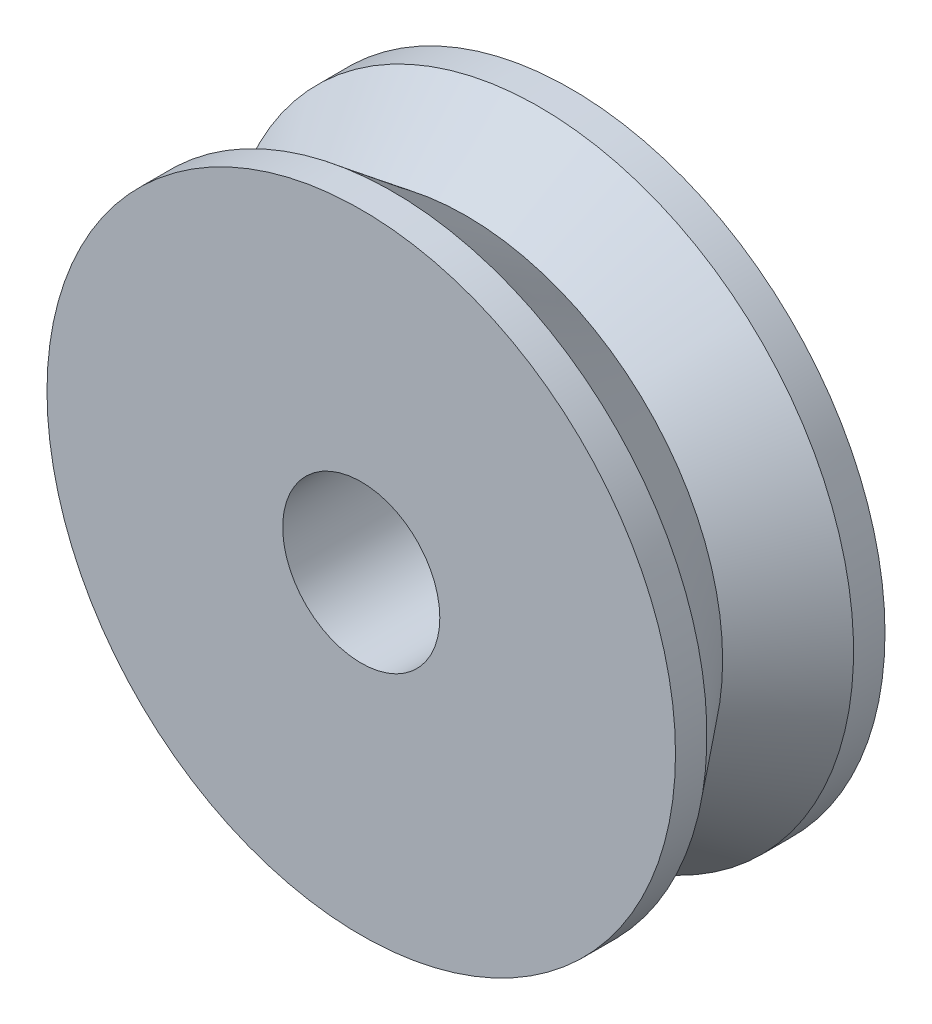
ISO-10303-21;
HEADER;
FILE_DESCRIPTION(('STEP AP214'),'2;1');
FILE_NAME('part.step','',(''),(''),'','','');
FILE_SCHEMA(('AUTOMOTIVE_DESIGN { 1 0 10303 214 1 1 1 1 }'));
ENDSEC;
DATA;
#1=APPLICATION_CONTEXT('core data for automotive mechanical design processes');
#2=APPLICATION_PROTOCOL_DEFINITION('international standard','automotive_design',2000,#1);
#3=PRODUCT_CONTEXT('',#1,'mechanical');
#4=PRODUCT('Part','Part','',(#3));
#5=PRODUCT_RELATED_PRODUCT_CATEGORY('part','',(#4));
#6=PRODUCT_DEFINITION_FORMATION('','',#4);
#7=PRODUCT_DEFINITION_CONTEXT('part definition',#1,'design');
#8=PRODUCT_DEFINITION('design','',#6,#7);
#9=PRODUCT_DEFINITION_SHAPE('','',#8);
#10=(LENGTH_UNIT() NAMED_UNIT(*) SI_UNIT(.MILLI.,.METRE.));
#11=(NAMED_UNIT(*) PLANE_ANGLE_UNIT() SI_UNIT($,.RADIAN.));
#12=(NAMED_UNIT(*) SI_UNIT($,.STERADIAN.) SOLID_ANGLE_UNIT());
#13=UNCERTAINTY_MEASURE_WITH_UNIT(LENGTH_MEASURE(1.E-05),#10,'distance_accuracy_value','');
#14=(GEOMETRIC_REPRESENTATION_CONTEXT(3) GLOBAL_UNCERTAINTY_ASSIGNED_CONTEXT((#13)) GLOBAL_UNIT_ASSIGNED_CONTEXT((#10,
#11,#12)) REPRESENTATION_CONTEXT('',''));
#15=CARTESIAN_POINT('',(0.,0.,0.));
#16=DIRECTION('',(0.,0.,1.));
#17=DIRECTION('',(1.,0.,0.));
#18=AXIS2_PLACEMENT_3D('',#15,#16,#17);
#19=CARTESIAN_POINT('',(0.,0.,4.));
#20=DIRECTION('',(0.,0.,-1.));
#21=DIRECTION('',(-1.,0.,0.));
#22=AXIS2_PLACEMENT_3D('',#19,#20,#21);
#23=CYLINDRICAL_SURFACE('',#22,6.);
#24=CARTESIAN_POINT('',(0.,0.,0.6));
#25=DIRECTION('',(0.,0.,-1.));
#26=DIRECTION('',(-1.,0.,0.));
#27=AXIS2_PLACEMENT_3D('',#24,#25,#26);
#28=CIRCLE('',#27,6.);
#29=CARTESIAN_POINT('',(-6.,0.,0.6));
#30=VERTEX_POINT('',#29);
#31=EDGE_CURVE('E49',#30,#30,#28,.T.);
#32=ORIENTED_EDGE('',*,*,#31,.T.);
#33=EDGE_LOOP('',(#32));
#34=FACE_BOUND('',#33,.T.);
#35=CARTESIAN_POINT('',(0.,0.,0.));
#36=DIRECTION('',(0.,0.,1.));
#37=DIRECTION('',(1.,0.,0.));
#38=AXIS2_PLACEMENT_3D('',#35,#36,#37);
#39=CIRCLE('',#38,6.);
#40=CARTESIAN_POINT('',(6.,0.,0.));
#41=VERTEX_POINT('',#40);
#42=EDGE_CURVE('E37',#41,#41,#39,.T.);
#43=ORIENTED_EDGE('',*,*,#42,.T.);
#44=EDGE_LOOP('',(#43));
#45=FACE_BOUND('',#44,.T.);
#46=ADVANCED_FACE('F33',(#34,#45),#23,.T.);
#47=CARTESIAN_POINT('',(0.,0.,4.));
#48=DIRECTION('',(0.,0.,1.));
#49=DIRECTION('',(1.,0.,0.));
#50=AXIS2_PLACEMENT_3D('',#47,#48,#49);
#51=PLANE('',#50);
#52=CARTESIAN_POINT('',(0.,0.,4.));
#53=DIRECTION('',(0.,0.,1.));
#54=DIRECTION('',(1.,0.,0.));
#55=AXIS2_PLACEMENT_3D('',#52,#53,#54);
#56=CIRCLE('',#55,6.);
#57=CARTESIAN_POINT('',(6.,0.,4.));
#58=VERTEX_POINT('',#57);
#59=EDGE_CURVE('E10',#58,#58,#56,.T.);
#60=ORIENTED_EDGE('',*,*,#59,.T.);
#61=EDGE_LOOP('',(#60));
#62=FACE_BOUND('',#61,.T.);
#63=CARTESIAN_POINT('',(0.,0.,4.));
#64=DIRECTION('',(0.,0.,1.));
#65=DIRECTION('',(1.,0.,0.));
#66=AXIS2_PLACEMENT_3D('',#63,#64,#65);
#67=CIRCLE('',#66,1.5);
#68=CARTESIAN_POINT('',(1.5,0.,4.));
#69=VERTEX_POINT('',#68);
#70=EDGE_CURVE('E44',#69,#69,#67,.T.);
#71=ORIENTED_EDGE('',*,*,#70,.F.);
#72=EDGE_LOOP('',(#71));
#73=FACE_BOUND('',#72,.T.);
#74=ADVANCED_FACE('F74',(#62,#73),#51,.T.);
#75=CARTESIAN_POINT('',(0.,0.,0.));
#76=DIRECTION('',(0.,0.,1.));
#77=DIRECTION('',(1.,0.,0.));
#78=AXIS2_PLACEMENT_3D('',#75,#76,#77);
#79=PLANE('',#78);
#80=ORIENTED_EDGE('',*,*,#42,.F.);
#81=EDGE_LOOP('',(#80));
#82=FACE_BOUND('',#81,.T.);
#83=CARTESIAN_POINT('',(0.,0.,0.));
#84=DIRECTION('',(0.,0.,1.));
#85=DIRECTION('',(1.,0.,0.));
#86=AXIS2_PLACEMENT_3D('',#83,#84,#85);
#87=CIRCLE('',#86,1.5);
#88=CARTESIAN_POINT('',(1.5,0.,0.));
#89=VERTEX_POINT('',#88);
#90=EDGE_CURVE('E46',#89,#89,#87,.T.);
#91=ORIENTED_EDGE('',*,*,#90,.T.);
#92=EDGE_LOOP('',(#91));
#93=FACE_BOUND('',#92,.T.);
#94=ADVANCED_FACE('F66',(#82,#93),#79,.F.);
#95=CARTESIAN_POINT('',(0.,0.,3.4));
#96=DIRECTION('',(0.,0.,-1.));
#97=DIRECTION('',(-1.,0.,0.));
#98=AXIS2_PLACEMENT_3D('',#95,#96,#97);
#99=CIRCLE('',#98,6.);
#100=CARTESIAN_POINT('',(-6.,0.,3.4));
#101=VERTEX_POINT('',#100);
#102=EDGE_CURVE('E57',#101,#101,#99,.T.);
#103=ORIENTED_EDGE('',*,*,#102,.F.);
#104=EDGE_LOOP('',(#103));
#105=FACE_BOUND('',#104,.T.);
#106=ORIENTED_EDGE('',*,*,#59,.F.);
#107=EDGE_LOOP('',(#106));
#108=FACE_BOUND('',#107,.T.);
#109=ADVANCED_FACE('F35',(#105,#108),#23,.T.);
#110=CARTESIAN_POINT('',(0.,0.,4.));
#111=DIRECTION('',(0.,0.,-1.));
#112=DIRECTION('',(-1.,0.,0.));
#113=AXIS2_PLACEMENT_3D('',#110,#111,#112);
#114=CYLINDRICAL_SURFACE('',#113,1.5);
#115=ORIENTED_EDGE('',*,*,#70,.T.);
#116=EDGE_LOOP('',(#115));
#117=FACE_BOUND('',#116,.T.);
#118=ORIENTED_EDGE('',*,*,#90,.F.);
#119=EDGE_LOOP('',(#118));
#120=FACE_BOUND('',#119,.T.);
#121=ADVANCED_FACE('F65',(#117,#120),#114,.F.);
#122=CARTESIAN_POINT('',(0.,0.,2.));
#123=DIRECTION('',(0.,0.,-1.));
#124=DIRECTION('',(-1.,0.,0.));
#125=AXIS2_PLACEMENT_3D('',#122,#123,#124);
#126=CONICAL_SURFACE('',#125,4.9,0.66596923737911);
#127=ORIENTED_EDGE('',*,*,#31,.F.);
#128=EDGE_LOOP('',(#127));
#129=FACE_BOUND('',#128,.T.);
#130=CARTESIAN_POINT('',(0.,0.,2.));
#131=DIRECTION('',(0.,0.,-1.));
#132=DIRECTION('',(-1.,0.,0.));
#133=AXIS2_PLACEMENT_3D('',#130,#131,#132);
#134=CIRCLE('',#133,4.9);
#135=CARTESIAN_POINT('',(-4.9,0.,2.));
#136=VERTEX_POINT('',#135);
#137=EDGE_CURVE('E54',#136,#136,#134,.T.);
#138=ORIENTED_EDGE('',*,*,#137,.T.);
#139=EDGE_LOOP('',(#138));
#140=FACE_BOUND('',#139,.T.);
#141=ADVANCED_FACE('F71',(#129,#140),#126,.T.);
#142=CARTESIAN_POINT('',(0.,0.,3.4));
#143=DIRECTION('',(0.,0.,1.));
#144=DIRECTION('',(1.,0.,0.));
#145=AXIS2_PLACEMENT_3D('',#142,#143,#144);
#146=CONICAL_SURFACE('',#145,6.,0.66596923737911);
#147=ORIENTED_EDGE('',*,*,#137,.F.);
#148=EDGE_LOOP('',(#147));
#149=FACE_BOUND('',#148,.T.);
#150=ORIENTED_EDGE('',*,*,#102,.T.);
#151=EDGE_LOOP('',(#150));
#152=FACE_BOUND('',#151,.T.);
#153=ADVANCED_FACE('F61',(#149,#152),#146,.T.);
#154=CLOSED_SHELL('',(#46,#74,#94,#109,#121,#141,#153));
#155=MANIFOLD_SOLID_BREP('B2',#154);
#156=ADVANCED_BREP_SHAPE_REPRESENTATION('',(#18,#155),#14);
#157=SHAPE_DEFINITION_REPRESENTATION(#9,#156);
ENDSEC;
END-ISO-10303-21;
